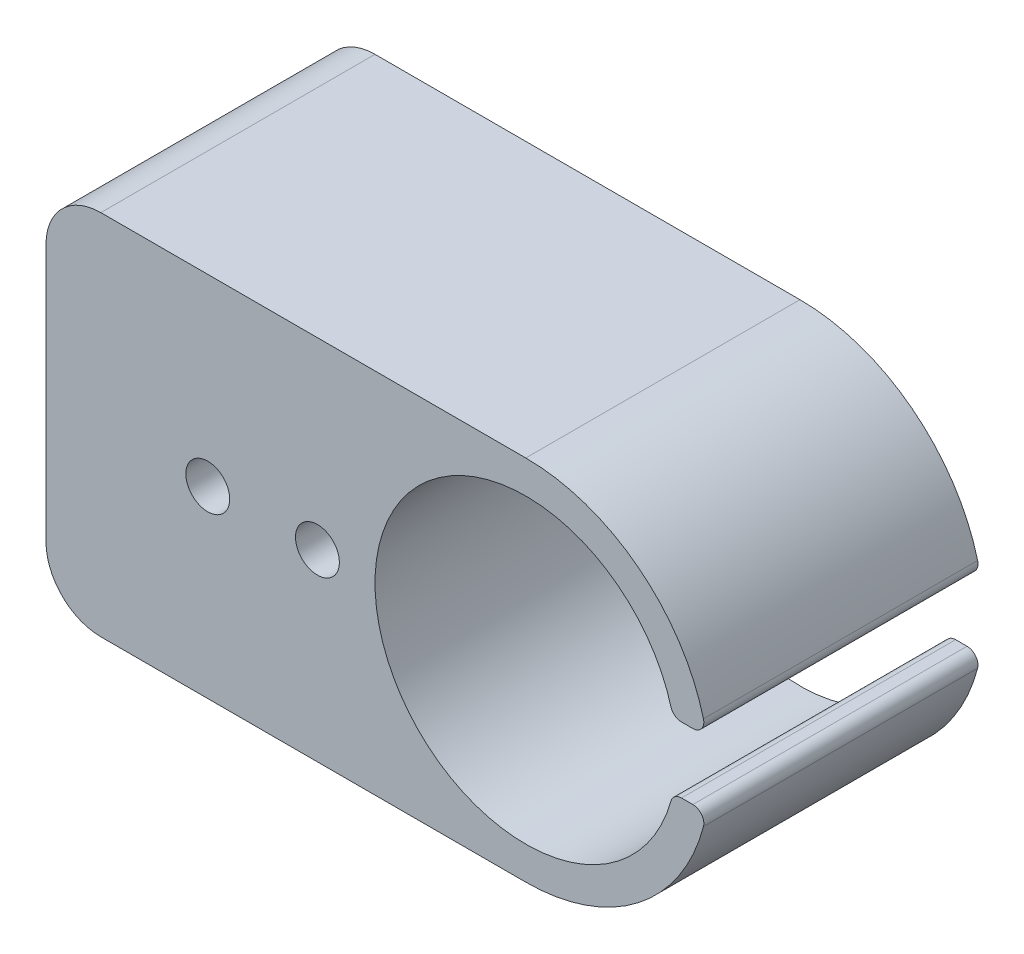
ISO-10303-21;
HEADER;
FILE_DESCRIPTION(('STEP AP214'),'2;1');
FILE_NAME('part.step','',(''),(''),'','','');
FILE_SCHEMA(('AUTOMOTIVE_DESIGN { 1 0 10303 214 1 1 1 1 }'));
ENDSEC;
DATA;
#1=APPLICATION_CONTEXT('core data for automotive mechanical design processes');
#2=APPLICATION_PROTOCOL_DEFINITION('international standard','automotive_design',2000,#1);
#3=PRODUCT_CONTEXT('',#1,'mechanical');
#4=PRODUCT('Part','Part','',(#3));
#5=PRODUCT_RELATED_PRODUCT_CATEGORY('part','',(#4));
#6=PRODUCT_DEFINITION_FORMATION('','',#4);
#7=PRODUCT_DEFINITION_CONTEXT('part definition',#1,'design');
#8=PRODUCT_DEFINITION('design','',#6,#7);
#9=PRODUCT_DEFINITION_SHAPE('','',#8);
#10=(LENGTH_UNIT() NAMED_UNIT(*) SI_UNIT(.MILLI.,.METRE.));
#11=(NAMED_UNIT(*) PLANE_ANGLE_UNIT() SI_UNIT($,.RADIAN.));
#12=(NAMED_UNIT(*) SI_UNIT($,.STERADIAN.) SOLID_ANGLE_UNIT());
#13=UNCERTAINTY_MEASURE_WITH_UNIT(LENGTH_MEASURE(1.E-05),#10,'distance_accuracy_value','');
#14=(GEOMETRIC_REPRESENTATION_CONTEXT(3) GLOBAL_UNCERTAINTY_ASSIGNED_CONTEXT((#13)) GLOBAL_UNIT_ASSIGNED_CONTEXT((#10,
#11,#12)) REPRESENTATION_CONTEXT('',''));
#15=CARTESIAN_POINT('',(0.,0.,0.));
#16=DIRECTION('',(0.,0.,1.));
#17=DIRECTION('',(1.,0.,0.));
#18=AXIS2_PLACEMENT_3D('',#15,#16,#17);
#19=CARTESIAN_POINT('',(0.,0.,25.));
#20=DIRECTION('',(0.,0.,1.));
#21=DIRECTION('',(1.,0.,0.));
#22=AXIS2_PLACEMENT_3D('',#19,#20,#21);
#23=PLANE('',#22);
#24=CARTESIAN_POINT('',(-29.,0.,25.));
#25=DIRECTION('',(0.,0.,1.));
#26=DIRECTION('',(1.,0.,0.));
#27=AXIS2_PLACEMENT_3D('',#24,#25,#26);
#28=CIRCLE('',#27,2.);
#29=CARTESIAN_POINT('',(-27.,0.,25.));
#30=VERTEX_POINT('',#29);
#31=EDGE_CURVE('E181',#30,#30,#28,.T.);
#32=ORIENTED_EDGE('',*,*,#31,.F.);
#33=EDGE_LOOP('',(#32));
#34=FACE_BOUND('',#33,.T.);
#35=CARTESIAN_POINT('',(0.,0.,25.));
#36=DIRECTION('',(0.,0.,1.));
#37=DIRECTION('',(-1.,0.,0.));
#38=AXIS2_PLACEMENT_3D('',#35,#36,#37);
#39=CIRCLE('',#38,16.75);
#40=CARTESIAN_POINT('',(0.,-16.75,25.));
#41=VERTEX_POINT('',#40);
#42=CARTESIAN_POINT('',(16.2008102912858,-4.25396825396825,25.));
#43=VERTEX_POINT('',#42);
#44=EDGE_CURVE('E172',#41,#43,#39,.T.);
#45=ORIENTED_EDGE('',*,*,#44,.T.);
#46=CARTESIAN_POINT('',(15.2335977365821,-4.,25.));
#47=DIRECTION('',(0.,0.,1.));
#48=DIRECTION('',(1.,0.,0.));
#49=AXIS2_PLACEMENT_3D('',#46,#47,#48);
#50=CIRCLE('',#49,1.);
#51=CARTESIAN_POINT('',(15.2335977365821,-3.,25.));
#52=VERTEX_POINT('',#51);
#53=EDGE_CURVE('E236',#43,#52,#50,.T.);
#54=ORIENTED_EDGE('',*,*,#53,.T.);
#55=DIRECTION('',(-1.,0.,0.));
#56=VECTOR('',#55,1.);
#57=CARTESIAN_POINT('',(16.479153497677,-3.,25.));
#58=LINE('',#57,#56);
#59=CARTESIAN_POINT('',(14.1972708645007,-3.,25.));
#60=VERTEX_POINT('',#59);
#61=EDGE_CURVE('E174',#52,#60,#58,.T.);
#62=ORIENTED_EDGE('',*,*,#61,.T.);
#63=CARTESIAN_POINT('',(14.1972708645007,-4.,25.));
#64=DIRECTION('',(0.,0.,1.));
#65=DIRECTION('',(1.,0.,0.));
#66=AXIS2_PLACEMENT_3D('',#63,#64,#65);
#67=CIRCLE('',#66,1.);
#68=CARTESIAN_POINT('',(13.2347440262295,-3.72881355932203,25.));
#69=VERTEX_POINT('',#68);
#70=EDGE_CURVE('E233',#60,#69,#67,.T.);
#71=ORIENTED_EDGE('',*,*,#70,.T.);
#72=CARTESIAN_POINT('',(0.,0.,25.));
#73=DIRECTION('',(0.,0.,-1.));
#74=DIRECTION('',(1.,0.,0.));
#75=AXIS2_PLACEMENT_3D('',#72,#73,#74);
#76=CIRCLE('',#75,13.75);
#77=CARTESIAN_POINT('',(13.2347440262295,3.72881355932203,25.));
#78=VERTEX_POINT('',#77);
#79=EDGE_CURVE('E197',#69,#78,#76,.T.);
#80=ORIENTED_EDGE('',*,*,#79,.T.);
#81=CARTESIAN_POINT('',(14.1972708645007,4.,25.));
#82=DIRECTION('',(0.,0.,1.));
#83=DIRECTION('',(1.,0.,0.));
#84=AXIS2_PLACEMENT_3D('',#81,#82,#83);
#85=CIRCLE('',#84,1.);
#86=CARTESIAN_POINT('',(14.1972708645007,3.,25.));
#87=VERTEX_POINT('',#86);
#88=EDGE_CURVE('E231',#78,#87,#85,.T.);
#89=ORIENTED_EDGE('',*,*,#88,.T.);
#90=DIRECTION('',(1.,0.,0.));
#91=VECTOR('',#90,1.);
#92=CARTESIAN_POINT('',(13.4187369003196,3.,25.));
#93=LINE('',#92,#91);
#94=CARTESIAN_POINT('',(15.2335977365821,3.,25.));
#95=VERTEX_POINT('',#94);
#96=EDGE_CURVE('E148',#87,#95,#93,.T.);
#97=ORIENTED_EDGE('',*,*,#96,.T.);
#98=CARTESIAN_POINT('',(15.2335977365821,4.,25.));
#99=DIRECTION('',(0.,0.,1.));
#100=DIRECTION('',(1.,0.,0.));
#101=AXIS2_PLACEMENT_3D('',#98,#99,#100);
#102=CIRCLE('',#101,1.);
#103=CARTESIAN_POINT('',(16.2008102912858,4.25396825396825,25.));
#104=VERTEX_POINT('',#103);
#105=EDGE_CURVE('E52',#95,#104,#102,.T.);
#106=ORIENTED_EDGE('',*,*,#105,.T.);
#107=CARTESIAN_POINT('',(0.,0.,25.));
#108=DIRECTION('',(0.,0.,1.));
#109=DIRECTION('',(1.,0.,0.));
#110=AXIS2_PLACEMENT_3D('',#107,#108,#109);
#111=CIRCLE('',#110,16.75);
#112=CARTESIAN_POINT('',(0.,16.75,25.));
#113=VERTEX_POINT('',#112);
#114=EDGE_CURVE('E138',#104,#113,#111,.T.);
#115=ORIENTED_EDGE('',*,*,#114,.T.);
#116=DIRECTION('',(-1.,0.,0.));
#117=VECTOR('',#116,1.);
#118=CARTESIAN_POINT('',(-43.75,16.75,25.));
#119=LINE('',#118,#117);
#120=CARTESIAN_POINT('',(-38.75,16.75,25.));
#121=VERTEX_POINT('',#120);
#122=EDGE_CURVE('E143',#113,#121,#119,.T.);
#123=ORIENTED_EDGE('',*,*,#122,.T.);
#124=CARTESIAN_POINT('',(-38.75,11.75,25.));
#125=DIRECTION('',(0.,0.,1.));
#126=DIRECTION('',(1.,0.,0.));
#127=AXIS2_PLACEMENT_3D('',#124,#125,#126);
#128=CIRCLE('',#127,5.);
#129=CARTESIAN_POINT('',(-43.75,11.75,25.));
#130=VERTEX_POINT('',#129);
#131=EDGE_CURVE('E211',#121,#130,#128,.T.);
#132=ORIENTED_EDGE('',*,*,#131,.T.);
#133=DIRECTION('',(0.,-1.,0.));
#134=VECTOR('',#133,1.);
#135=CARTESIAN_POINT('',(-43.75,-16.75,25.));
#136=LINE('',#135,#134);
#137=CARTESIAN_POINT('',(-43.75,-11.75,25.));
#138=VERTEX_POINT('',#137);
#139=EDGE_CURVE('E164',#130,#138,#136,.T.);
#140=ORIENTED_EDGE('',*,*,#139,.T.);
#141=CARTESIAN_POINT('',(-38.75,-11.75,25.));
#142=DIRECTION('',(0.,0.,1.));
#143=DIRECTION('',(1.,0.,0.));
#144=AXIS2_PLACEMENT_3D('',#141,#142,#143);
#145=CIRCLE('',#144,5.);
#146=CARTESIAN_POINT('',(-38.75,-16.75,25.));
#147=VERTEX_POINT('',#146);
#148=EDGE_CURVE('E213',#138,#147,#145,.T.);
#149=ORIENTED_EDGE('',*,*,#148,.T.);
#150=DIRECTION('',(1.,0.,0.));
#151=VECTOR('',#150,1.);
#152=CARTESIAN_POINT('',(0.,-16.75,25.));
#153=LINE('',#152,#151);
#154=EDGE_CURVE('E167',#147,#41,#153,.T.);
#155=ORIENTED_EDGE('',*,*,#154,.T.);
#156=EDGE_LOOP('',(#45,#54,#62,#71,#80,#89,#97,#106,#115,#123,#132,#140,#149,#155));
#157=FACE_BOUND('',#156,.T.);
#158=CARTESIAN_POINT('',(-19.,0.,25.));
#159=DIRECTION('',(0.,0.,1.));
#160=DIRECTION('',(1.,0.,0.));
#161=AXIS2_PLACEMENT_3D('',#158,#159,#160);
#162=CIRCLE('',#161,2.);
#163=CARTESIAN_POINT('',(-17.,0.,25.));
#164=VERTEX_POINT('',#163);
#165=EDGE_CURVE('E533',#164,#164,#162,.T.);
#166=ORIENTED_EDGE('',*,*,#165,.F.);
#167=EDGE_LOOP('',(#166));
#168=FACE_BOUND('',#167,.T.);
#169=ADVANCED_FACE('F37',(#34,#157,#168),#23,.T.);
#170=CARTESIAN_POINT('',(0.,0.,0.));
#171=DIRECTION('',(0.,0.,1.));
#172=DIRECTION('',(1.,0.,0.));
#173=AXIS2_PLACEMENT_3D('',#170,#171,#172);
#174=PLANE('',#173);
#175=DIRECTION('',(-1.,0.,0.));
#176=VECTOR('',#175,1.);
#177=CARTESIAN_POINT('',(16.479153497677,-3.,0.));
#178=LINE('',#177,#176);
#179=CARTESIAN_POINT('',(15.2335977365821,-3.,0.));
#180=VERTEX_POINT('',#179);
#181=CARTESIAN_POINT('',(14.1972708645007,-3.,0.));
#182=VERTEX_POINT('',#181);
#183=EDGE_CURVE('E194',#180,#182,#178,.T.);
#184=ORIENTED_EDGE('',*,*,#183,.F.);
#185=CARTESIAN_POINT('',(15.2335977365821,-4.,0.));
#186=DIRECTION('',(0.,0.,1.));
#187=DIRECTION('',(1.,0.,0.));
#188=AXIS2_PLACEMENT_3D('',#185,#186,#187);
#189=CIRCLE('',#188,1.);
#190=CARTESIAN_POINT('',(16.2008102912858,-4.25396825396825,0.));
#191=VERTEX_POINT('',#190);
#192=EDGE_CURVE('E227',#180,#191,#189,.F.);
#193=ORIENTED_EDGE('',*,*,#192,.T.);
#194=CARTESIAN_POINT('',(0.,0.,0.));
#195=DIRECTION('',(0.,0.,1.));
#196=DIRECTION('',(-1.,0.,0.));
#197=AXIS2_PLACEMENT_3D('',#194,#195,#196);
#198=CIRCLE('',#197,16.75);
#199=CARTESIAN_POINT('',(0.,-16.75,0.));
#200=VERTEX_POINT('',#199);
#201=EDGE_CURVE('E191',#200,#191,#198,.T.);
#202=ORIENTED_EDGE('',*,*,#201,.F.);
#203=DIRECTION('',(1.,0.,0.));
#204=VECTOR('',#203,1.);
#205=CARTESIAN_POINT('',(0.,-16.75,0.));
#206=LINE('',#205,#204);
#207=CARTESIAN_POINT('',(-38.75,-16.75,0.));
#208=VERTEX_POINT('',#207);
#209=EDGE_CURVE('E189',#208,#200,#206,.T.);
#210=ORIENTED_EDGE('',*,*,#209,.F.);
#211=CARTESIAN_POINT('',(-38.75,-11.75,0.));
#212=DIRECTION('',(0.,0.,1.));
#213=DIRECTION('',(1.,0.,0.));
#214=AXIS2_PLACEMENT_3D('',#211,#212,#213);
#215=CIRCLE('',#214,5.);
#216=CARTESIAN_POINT('',(-43.75,-11.75,0.));
#217=VERTEX_POINT('',#216);
#218=EDGE_CURVE('E204',#208,#217,#215,.F.);
#219=ORIENTED_EDGE('',*,*,#218,.T.);
#220=DIRECTION('',(0.,-1.,0.));
#221=VECTOR('',#220,1.);
#222=CARTESIAN_POINT('',(-43.75,-16.75,0.));
#223=LINE('',#222,#221);
#224=CARTESIAN_POINT('',(-43.75,11.75,0.));
#225=VERTEX_POINT('',#224);
#226=EDGE_CURVE('E186',#225,#217,#223,.T.);
#227=ORIENTED_EDGE('',*,*,#226,.F.);
#228=CARTESIAN_POINT('',(-38.75,11.75,0.));
#229=DIRECTION('',(0.,0.,1.));
#230=DIRECTION('',(1.,0.,0.));
#231=AXIS2_PLACEMENT_3D('',#228,#229,#230);
#232=CIRCLE('',#231,5.);
#233=CARTESIAN_POINT('',(-38.75,16.75,0.));
#234=VERTEX_POINT('',#233);
#235=EDGE_CURVE('E202',#225,#234,#232,.F.);
#236=ORIENTED_EDGE('',*,*,#235,.T.);
#237=DIRECTION('',(-1.,0.,0.));
#238=VECTOR('',#237,1.);
#239=CARTESIAN_POINT('',(-43.75,16.75,0.));
#240=LINE('',#239,#238);
#241=CARTESIAN_POINT('',(0.,16.75,0.));
#242=VERTEX_POINT('',#241);
#243=EDGE_CURVE('E184',#242,#234,#240,.T.);
#244=ORIENTED_EDGE('',*,*,#243,.F.);
#245=CARTESIAN_POINT('',(0.,0.,0.));
#246=DIRECTION('',(0.,0.,1.));
#247=DIRECTION('',(1.,0.,0.));
#248=AXIS2_PLACEMENT_3D('',#245,#246,#247);
#249=CIRCLE('',#248,16.75);
#250=CARTESIAN_POINT('',(16.2008102912858,4.25396825396825,0.));
#251=VERTEX_POINT('',#250);
#252=EDGE_CURVE('E154',#251,#242,#249,.T.);
#253=ORIENTED_EDGE('',*,*,#252,.F.);
#254=CARTESIAN_POINT('',(15.2335977365821,4.,0.));
#255=DIRECTION('',(0.,0.,1.));
#256=DIRECTION('',(1.,0.,0.));
#257=AXIS2_PLACEMENT_3D('',#254,#255,#256);
#258=CIRCLE('',#257,1.);
#259=CARTESIAN_POINT('',(15.2335977365821,3.,0.));
#260=VERTEX_POINT('',#259);
#261=EDGE_CURVE('E225',#251,#260,#258,.F.);
#262=ORIENTED_EDGE('',*,*,#261,.T.);
#263=DIRECTION('',(1.,0.,0.));
#264=VECTOR('',#263,1.);
#265=CARTESIAN_POINT('',(13.4187369003196,3.,0.));
#266=LINE('',#265,#264);
#267=CARTESIAN_POINT('',(14.1972708645007,3.,0.));
#268=VERTEX_POINT('',#267);
#269=EDGE_CURVE('E180',#268,#260,#266,.T.);
#270=ORIENTED_EDGE('',*,*,#269,.F.);
#271=CARTESIAN_POINT('',(14.1972708645007,4.,0.));
#272=DIRECTION('',(0.,0.,1.));
#273=DIRECTION('',(1.,0.,0.));
#274=AXIS2_PLACEMENT_3D('',#271,#272,#273);
#275=CIRCLE('',#274,1.);
#276=CARTESIAN_POINT('',(13.2347440262295,3.72881355932203,0.));
#277=VERTEX_POINT('',#276);
#278=EDGE_CURVE('E221',#268,#277,#275,.F.);
#279=ORIENTED_EDGE('',*,*,#278,.T.);
#280=CARTESIAN_POINT('',(0.,0.,0.));
#281=DIRECTION('',(0.,0.,-1.));
#282=DIRECTION('',(1.,0.,0.));
#283=AXIS2_PLACEMENT_3D('',#280,#281,#282);
#284=CIRCLE('',#283,13.75);
#285=CARTESIAN_POINT('',(13.2347440262295,-3.72881355932203,0.));
#286=VERTEX_POINT('',#285);
#287=EDGE_CURVE('E177',#286,#277,#284,.T.);
#288=ORIENTED_EDGE('',*,*,#287,.F.);
#289=CARTESIAN_POINT('',(14.1972708645007,-4.,0.));
#290=DIRECTION('',(0.,0.,1.));
#291=DIRECTION('',(1.,0.,0.));
#292=AXIS2_PLACEMENT_3D('',#289,#290,#291);
#293=CIRCLE('',#292,1.);
#294=EDGE_CURVE('E223',#286,#182,#293,.F.);
#295=ORIENTED_EDGE('',*,*,#294,.T.);
#296=EDGE_LOOP('',(#184,#193,#202,#210,#219,#227,#236,#244,#253,#262,#270,#279,#288,#295));
#297=FACE_BOUND('',#296,.T.);
#298=CARTESIAN_POINT('',(-29.,0.,0.));
#299=DIRECTION('',(0.,0.,1.));
#300=DIRECTION('',(1.,0.,0.));
#301=AXIS2_PLACEMENT_3D('',#298,#299,#300);
#302=CIRCLE('',#301,2.);
#303=CARTESIAN_POINT('',(-27.,0.,0.));
#304=VERTEX_POINT('',#303);
#305=EDGE_CURVE('E532',#304,#304,#302,.T.);
#306=ORIENTED_EDGE('',*,*,#305,.T.);
#307=EDGE_LOOP('',(#306));
#308=FACE_BOUND('',#307,.T.);
#309=CARTESIAN_POINT('',(-19.,0.,0.));
#310=DIRECTION('',(0.,0.,1.));
#311=DIRECTION('',(1.,0.,0.));
#312=AXIS2_PLACEMENT_3D('',#309,#310,#311);
#313=CIRCLE('',#312,2.);
#314=CARTESIAN_POINT('',(-17.,0.,0.));
#315=VERTEX_POINT('',#314);
#316=EDGE_CURVE('E537',#315,#315,#313,.T.);
#317=ORIENTED_EDGE('',*,*,#316,.T.);
#318=EDGE_LOOP('',(#317));
#319=FACE_BOUND('',#318,.T.);
#320=ADVANCED_FACE('F259',(#297,#308,#319),#174,.F.);
#321=CARTESIAN_POINT('',(0.,0.,25.));
#322=DIRECTION('',(0.,0.,-1.));
#323=DIRECTION('',(-1.,0.,0.));
#324=AXIS2_PLACEMENT_3D('',#321,#322,#323);
#325=CYLINDRICAL_SURFACE('',#324,13.75);
#326=ORIENTED_EDGE('',*,*,#79,.F.);
#327=DIRECTION('',(0.,0.,-1.));
#328=VECTOR('',#327,1.);
#329=CARTESIAN_POINT('',(13.2347440262294,-3.72881355932203,25.));
#330=LINE('',#329,#328);
#331=EDGE_CURVE('E11',#69,#286,#330,.T.);
#332=ORIENTED_EDGE('',*,*,#331,.T.);
#333=ORIENTED_EDGE('',*,*,#287,.T.);
#334=DIRECTION('',(0.,0.,-1.));
#335=VECTOR('',#334,1.);
#336=CARTESIAN_POINT('',(13.2347440262294,3.72881355932203,25.));
#337=LINE('',#336,#335);
#338=EDGE_CURVE('E45',#277,#78,#337,.F.);
#339=ORIENTED_EDGE('',*,*,#338,.T.);
#340=EDGE_LOOP('',(#326,#332,#333,#339));
#341=FACE_BOUND('',#340,.T.);
#342=ADVANCED_FACE('F247',(#341),#325,.F.);
#343=CARTESIAN_POINT('',(13.4187369003196,3.,25.));
#344=DIRECTION('',(0.,1.,0.));
#345=DIRECTION('',(0.,0.,1.));
#346=AXIS2_PLACEMENT_3D('',#343,#344,#345);
#347=PLANE('',#346);
#348=ORIENTED_EDGE('',*,*,#269,.T.);
#349=DIRECTION('',(0.,0.,-1.));
#350=VECTOR('',#349,1.);
#351=CARTESIAN_POINT('',(15.2335977365821,3.,25.));
#352=LINE('',#351,#350);
#353=EDGE_CURVE('E60',#260,#95,#352,.F.);
#354=ORIENTED_EDGE('',*,*,#353,.T.);
#355=ORIENTED_EDGE('',*,*,#96,.F.);
#356=DIRECTION('',(0.,0.,-1.));
#357=VECTOR('',#356,1.);
#358=CARTESIAN_POINT('',(14.1972708645007,3.,25.));
#359=LINE('',#358,#357);
#360=EDGE_CURVE('E240',#87,#268,#359,.T.);
#361=ORIENTED_EDGE('',*,*,#360,.T.);
#362=EDGE_LOOP('',(#348,#354,#355,#361));
#363=FACE_BOUND('',#362,.T.);
#364=ADVANCED_FACE('F256',(#363),#347,.F.);
#365=CARTESIAN_POINT('',(0.,0.,25.));
#366=DIRECTION('',(0.,0.,-1.));
#367=DIRECTION('',(-1.,0.,0.));
#368=AXIS2_PLACEMENT_3D('',#365,#366,#367);
#369=CYLINDRICAL_SURFACE('',#368,16.75);
#370=ORIENTED_EDGE('',*,*,#114,.F.);
#371=DIRECTION('',(0.,0.,-1.));
#372=VECTOR('',#371,1.);
#373=CARTESIAN_POINT('',(16.2008102912858,4.25396825396825,25.));
#374=LINE('',#373,#372);
#375=EDGE_CURVE('E238',#104,#251,#374,.T.);
#376=ORIENTED_EDGE('',*,*,#375,.T.);
#377=ORIENTED_EDGE('',*,*,#252,.T.);
#378=DIRECTION('',(0.,0.,-1.));
#379=VECTOR('',#378,1.);
#380=CARTESIAN_POINT('',(0.,16.75,25.));
#381=LINE('',#380,#379);
#382=EDGE_CURVE('E151',#113,#242,#381,.T.);
#383=ORIENTED_EDGE('',*,*,#382,.F.);
#384=EDGE_LOOP('',(#370,#376,#377,#383));
#385=FACE_BOUND('',#384,.T.);
#386=ADVANCED_FACE('F152',(#385),#369,.T.);
#387=CARTESIAN_POINT('',(-43.75,16.75,25.));
#388=DIRECTION('',(0.,-1.,0.));
#389=DIRECTION('',(0.,0.,-1.));
#390=AXIS2_PLACEMENT_3D('',#387,#388,#389);
#391=PLANE('',#390);
#392=ORIENTED_EDGE('',*,*,#243,.T.);
#393=DIRECTION('',(0.,0.,-1.));
#394=VECTOR('',#393,1.);
#395=CARTESIAN_POINT('',(-38.75,16.75,25.));
#396=LINE('',#395,#394);
#397=EDGE_CURVE('E163',#234,#121,#396,.F.);
#398=ORIENTED_EDGE('',*,*,#397,.T.);
#399=ORIENTED_EDGE('',*,*,#122,.F.);
#400=ORIENTED_EDGE('',*,*,#382,.T.);
#401=EDGE_LOOP('',(#392,#398,#399,#400));
#402=FACE_BOUND('',#401,.T.);
#403=ADVANCED_FACE('F161',(#402),#391,.F.);
#404=CARTESIAN_POINT('',(-43.75,-16.75,25.));
#405=DIRECTION('',(1.,0.,0.));
#406=DIRECTION('',(0.,0.,-1.));
#407=AXIS2_PLACEMENT_3D('',#404,#405,#406);
#408=PLANE('',#407);
#409=CARTESIAN_POINT('',(-43.75,0.,7.5));
#410=DIRECTION('',(-1.,0.,0.));
#411=DIRECTION('',(0.,0.,1.));
#412=AXIS2_PLACEMENT_3D('',#409,#410,#411);
#413=CIRCLE('',#412,2.);
#414=CARTESIAN_POINT('',(-43.75,0.,9.5));
#415=VERTEX_POINT('',#414);
#416=EDGE_CURVE('E549',#415,#415,#413,.T.);
#417=ORIENTED_EDGE('',*,*,#416,.F.);
#418=EDGE_LOOP('',(#417));
#419=FACE_BOUND('',#418,.T.);
#420=CARTESIAN_POINT('',(-43.75,0.,17.5));
#421=DIRECTION('',(-1.,0.,0.));
#422=DIRECTION('',(0.,0.,1.));
#423=AXIS2_PLACEMENT_3D('',#420,#421,#422);
#424=CIRCLE('',#423,2.);
#425=CARTESIAN_POINT('',(-43.75,0.,19.5));
#426=VERTEX_POINT('',#425);
#427=EDGE_CURVE('E546',#426,#426,#424,.T.);
#428=ORIENTED_EDGE('',*,*,#427,.F.);
#429=EDGE_LOOP('',(#428));
#430=FACE_BOUND('',#429,.T.);
#431=ORIENTED_EDGE('',*,*,#226,.T.);
#432=DIRECTION('',(0.,0.,-1.));
#433=VECTOR('',#432,1.);
#434=CARTESIAN_POINT('',(-43.75,-11.75,25.));
#435=LINE('',#434,#433);
#436=EDGE_CURVE('E209',#217,#138,#435,.F.);
#437=ORIENTED_EDGE('',*,*,#436,.T.);
#438=ORIENTED_EDGE('',*,*,#139,.F.);
#439=DIRECTION('',(0.,0.,-1.));
#440=VECTOR('',#439,1.);
#441=CARTESIAN_POINT('',(-43.75,11.75,25.));
#442=LINE('',#441,#440);
#443=EDGE_CURVE('E206',#130,#225,#442,.T.);
#444=ORIENTED_EDGE('',*,*,#443,.T.);
#445=EDGE_LOOP('',(#431,#437,#438,#444));
#446=FACE_BOUND('',#445,.T.);
#447=ADVANCED_FACE('F299',(#419,#430,#446),#408,.F.);
#448=CARTESIAN_POINT('',(0.,-16.75,25.));
#449=DIRECTION('',(0.,1.,0.));
#450=DIRECTION('',(0.,0.,1.));
#451=AXIS2_PLACEMENT_3D('',#448,#449,#450);
#452=PLANE('',#451);
#453=ORIENTED_EDGE('',*,*,#154,.F.);
#454=DIRECTION('',(0.,0.,-1.));
#455=VECTOR('',#454,1.);
#456=CARTESIAN_POINT('',(-38.75,-16.75,25.));
#457=LINE('',#456,#455);
#458=EDGE_CURVE('E158',#147,#208,#457,.T.);
#459=ORIENTED_EDGE('',*,*,#458,.T.);
#460=ORIENTED_EDGE('',*,*,#209,.T.);
#461=DIRECTION('',(0.,0.,-1.));
#462=VECTOR('',#461,1.);
#463=CARTESIAN_POINT('',(0.,-16.75,25.));
#464=LINE('',#463,#462);
#465=EDGE_CURVE('E159',#41,#200,#464,.T.);
#466=ORIENTED_EDGE('',*,*,#465,.F.);
#467=EDGE_LOOP('',(#453,#459,#460,#466));
#468=FACE_BOUND('',#467,.T.);
#469=ADVANCED_FACE('F295',(#468),#452,.F.);
#470=CARTESIAN_POINT('',(0.,0.,25.));
#471=DIRECTION('',(0.,0.,-1.));
#472=DIRECTION('',(-1.,0.,0.));
#473=AXIS2_PLACEMENT_3D('',#470,#471,#472);
#474=CYLINDRICAL_SURFACE('',#473,16.75);
#475=ORIENTED_EDGE('',*,*,#201,.T.);
#476=DIRECTION('',(0.,0.,-1.));
#477=VECTOR('',#476,1.);
#478=CARTESIAN_POINT('',(16.2008102912858,-4.25396825396825,25.));
#479=LINE('',#478,#477);
#480=EDGE_CURVE('E229',#191,#43,#479,.F.);
#481=ORIENTED_EDGE('',*,*,#480,.T.);
#482=ORIENTED_EDGE('',*,*,#44,.F.);
#483=ORIENTED_EDGE('',*,*,#465,.T.);
#484=EDGE_LOOP('',(#475,#481,#482,#483));
#485=FACE_BOUND('',#484,.T.);
#486=ADVANCED_FACE('F291',(#485),#474,.T.);
#487=CARTESIAN_POINT('',(16.479153497677,-3.,25.));
#488=DIRECTION('',(0.,-1.,0.));
#489=DIRECTION('',(0.,0.,-1.));
#490=AXIS2_PLACEMENT_3D('',#487,#488,#489);
#491=PLANE('',#490);
#492=ORIENTED_EDGE('',*,*,#61,.F.);
#493=DIRECTION('',(0.,0.,-1.));
#494=VECTOR('',#493,1.);
#495=CARTESIAN_POINT('',(15.2335977365821,-3.,25.));
#496=LINE('',#495,#494);
#497=EDGE_CURVE('E218',#52,#180,#496,.T.);
#498=ORIENTED_EDGE('',*,*,#497,.T.);
#499=ORIENTED_EDGE('',*,*,#183,.T.);
#500=DIRECTION('',(0.,0.,-1.));
#501=VECTOR('',#500,1.);
#502=CARTESIAN_POINT('',(14.1972708645007,-3.,25.));
#503=LINE('',#502,#501);
#504=EDGE_CURVE('E216',#182,#60,#503,.F.);
#505=ORIENTED_EDGE('',*,*,#504,.T.);
#506=EDGE_LOOP('',(#492,#498,#499,#505));
#507=FACE_BOUND('',#506,.T.);
#508=ADVANCED_FACE('F288',(#507),#491,.F.);
#509=CARTESIAN_POINT('',(-29.,0.,25.));
#510=DIRECTION('',(0.,0.,-1.));
#511=DIRECTION('',(-1.,0.,0.));
#512=AXIS2_PLACEMENT_3D('',#509,#510,#511);
#513=CYLINDRICAL_SURFACE('',#512,2.);
#514=ORIENTED_EDGE('',*,*,#31,.T.);
#515=EDGE_LOOP('',(#514));
#516=FACE_BOUND('',#515,.T.);
#517=ORIENTED_EDGE('',*,*,#305,.F.);
#518=EDGE_LOOP('',(#517));
#519=FACE_BOUND('',#518,.T.);
#520=ADVANCED_FACE('F285',(#516,#519),#513,.F.);
#521=CARTESIAN_POINT('',(-19.,0.,25.));
#522=DIRECTION('',(0.,0.,-1.));
#523=DIRECTION('',(-1.,0.,0.));
#524=AXIS2_PLACEMENT_3D('',#521,#522,#523);
#525=CYLINDRICAL_SURFACE('',#524,2.);
#526=ORIENTED_EDGE('',*,*,#165,.T.);
#527=EDGE_LOOP('',(#526));
#528=FACE_BOUND('',#527,.T.);
#529=ORIENTED_EDGE('',*,*,#316,.F.);
#530=EDGE_LOOP('',(#529));
#531=FACE_BOUND('',#530,.T.);
#532=ADVANCED_FACE('F418',(#528,#531),#525,.F.);
#533=CARTESIAN_POINT('',(-33.75,0.,17.5));
#534=DIRECTION('',(-1.,0.,0.));
#535=DIRECTION('',(0.,0.,1.));
#536=AXIS2_PLACEMENT_3D('',#533,#534,#535);
#537=CYLINDRICAL_SURFACE('',#536,2.);
#538=CARTESIAN_POINT('',(-33.75,0.,17.5));
#539=DIRECTION('',(-1.,0.,0.));
#540=DIRECTION('',(0.,0.,1.));
#541=AXIS2_PLACEMENT_3D('',#538,#539,#540);
#542=CIRCLE('',#541,2.);
#543=CARTESIAN_POINT('',(-33.75,0.,19.5));
#544=VERTEX_POINT('',#543);
#545=EDGE_CURVE('E543',#544,#544,#542,.T.);
#546=ORIENTED_EDGE('',*,*,#545,.F.);
#547=EDGE_LOOP('',(#546));
#548=FACE_BOUND('',#547,.T.);
#549=ORIENTED_EDGE('',*,*,#427,.T.);
#550=EDGE_LOOP('',(#549));
#551=FACE_BOUND('',#550,.T.);
#552=ADVANCED_FACE('F408',(#548,#551),#537,.F.);
#553=CARTESIAN_POINT('',(-33.75,0.,17.5));
#554=DIRECTION('',(-1.,0.,0.));
#555=DIRECTION('',(0.,0.,1.));
#556=AXIS2_PLACEMENT_3D('',#553,#554,#555);
#557=PLANE('',#556);
#558=ORIENTED_EDGE('',*,*,#545,.T.);
#559=EDGE_LOOP('',(#558));
#560=FACE_BOUND('',#559,.T.);
#561=ADVANCED_FACE('F398',(#560),#557,.T.);
#562=CARTESIAN_POINT('',(-33.75,0.,7.5));
#563=DIRECTION('',(-1.,0.,0.));
#564=DIRECTION('',(0.,0.,1.));
#565=AXIS2_PLACEMENT_3D('',#562,#563,#564);
#566=CYLINDRICAL_SURFACE('',#565,2.);
#567=CARTESIAN_POINT('',(-33.75,0.,7.5));
#568=DIRECTION('',(-1.,0.,0.));
#569=DIRECTION('',(0.,0.,1.));
#570=AXIS2_PLACEMENT_3D('',#567,#568,#569);
#571=CIRCLE('',#570,2.);
#572=CARTESIAN_POINT('',(-33.75,0.,9.5));
#573=VERTEX_POINT('',#572);
#574=EDGE_CURVE('E541',#573,#573,#571,.T.);
#575=ORIENTED_EDGE('',*,*,#574,.F.);
#576=EDGE_LOOP('',(#575));
#577=FACE_BOUND('',#576,.T.);
#578=ORIENTED_EDGE('',*,*,#416,.T.);
#579=EDGE_LOOP('',(#578));
#580=FACE_BOUND('',#579,.T.);
#581=ADVANCED_FACE('F388',(#577,#580),#566,.F.);
#582=CARTESIAN_POINT('',(-33.75,0.,7.5));
#583=DIRECTION('',(-1.,0.,0.));
#584=DIRECTION('',(0.,0.,1.));
#585=AXIS2_PLACEMENT_3D('',#582,#583,#584);
#586=PLANE('',#585);
#587=ORIENTED_EDGE('',*,*,#574,.T.);
#588=EDGE_LOOP('',(#587));
#589=FACE_BOUND('',#588,.T.);
#590=ADVANCED_FACE('F315',(#589),#586,.T.);
#591=CARTESIAN_POINT('',(-38.75,-11.75,25.));
#592=DIRECTION('',(0.,0.,-1.));
#593=DIRECTION('',(-1.,0.,0.));
#594=AXIS2_PLACEMENT_3D('',#591,#592,#593);
#595=CYLINDRICAL_SURFACE('',#594,5.);
#596=ORIENTED_EDGE('',*,*,#148,.F.);
#597=ORIENTED_EDGE('',*,*,#436,.F.);
#598=ORIENTED_EDGE('',*,*,#218,.F.);
#599=ORIENTED_EDGE('',*,*,#458,.F.);
#600=EDGE_LOOP('',(#596,#597,#598,#599));
#601=FACE_BOUND('',#600,.T.);
#602=ADVANCED_FACE('F312',(#601),#595,.T.);
#603=CARTESIAN_POINT('',(-38.75,11.75,25.));
#604=DIRECTION('',(0.,0.,-1.));
#605=DIRECTION('',(-1.,0.,0.));
#606=AXIS2_PLACEMENT_3D('',#603,#604,#605);
#607=CYLINDRICAL_SURFACE('',#606,5.);
#608=ORIENTED_EDGE('',*,*,#131,.F.);
#609=ORIENTED_EDGE('',*,*,#397,.F.);
#610=ORIENTED_EDGE('',*,*,#235,.F.);
#611=ORIENTED_EDGE('',*,*,#443,.F.);
#612=EDGE_LOOP('',(#608,#609,#610,#611));
#613=FACE_BOUND('',#612,.T.);
#614=ADVANCED_FACE('F272',(#613),#607,.T.);
#615=CARTESIAN_POINT('',(15.2335977365821,-4.,25.));
#616=DIRECTION('',(0.,0.,-1.));
#617=DIRECTION('',(-1.,0.,0.));
#618=AXIS2_PLACEMENT_3D('',#615,#616,#617);
#619=CYLINDRICAL_SURFACE('',#618,1.);
#620=ORIENTED_EDGE('',*,*,#53,.F.);
#621=ORIENTED_EDGE('',*,*,#480,.F.);
#622=ORIENTED_EDGE('',*,*,#192,.F.);
#623=ORIENTED_EDGE('',*,*,#497,.F.);
#624=EDGE_LOOP('',(#620,#621,#622,#623));
#625=FACE_BOUND('',#624,.T.);
#626=ADVANCED_FACE('F265',(#625),#619,.T.);
#627=CARTESIAN_POINT('',(15.2335977365821,4.,25.));
#628=DIRECTION('',(0.,0.,-1.));
#629=DIRECTION('',(-1.,0.,0.));
#630=AXIS2_PLACEMENT_3D('',#627,#628,#629);
#631=CYLINDRICAL_SURFACE('',#630,1.);
#632=ORIENTED_EDGE('',*,*,#105,.F.);
#633=ORIENTED_EDGE('',*,*,#353,.F.);
#634=ORIENTED_EDGE('',*,*,#261,.F.);
#635=ORIENTED_EDGE('',*,*,#375,.F.);
#636=EDGE_LOOP('',(#632,#633,#634,#635));
#637=FACE_BOUND('',#636,.T.);
#638=ADVANCED_FACE('F262',(#637),#631,.T.);
#639=CARTESIAN_POINT('',(14.1972708645007,-4.,25.));
#640=DIRECTION('',(0.,0.,-1.));
#641=DIRECTION('',(-1.,0.,0.));
#642=AXIS2_PLACEMENT_3D('',#639,#640,#641);
#643=CYLINDRICAL_SURFACE('',#642,1.);
#644=ORIENTED_EDGE('',*,*,#70,.F.);
#645=ORIENTED_EDGE('',*,*,#504,.F.);
#646=ORIENTED_EDGE('',*,*,#294,.F.);
#647=ORIENTED_EDGE('',*,*,#331,.F.);
#648=EDGE_LOOP('',(#644,#645,#646,#647));
#649=FACE_BOUND('',#648,.T.);
#650=ADVANCED_FACE('F264',(#649),#643,.T.);
#651=CARTESIAN_POINT('',(14.1972708645007,4.,25.));
#652=DIRECTION('',(0.,0.,-1.));
#653=DIRECTION('',(-1.,0.,0.));
#654=AXIS2_PLACEMENT_3D('',#651,#652,#653);
#655=CYLINDRICAL_SURFACE('',#654,1.);
#656=ORIENTED_EDGE('',*,*,#88,.F.);
#657=ORIENTED_EDGE('',*,*,#338,.F.);
#658=ORIENTED_EDGE('',*,*,#278,.F.);
#659=ORIENTED_EDGE('',*,*,#360,.F.);
#660=EDGE_LOOP('',(#656,#657,#658,#659));
#661=FACE_BOUND('',#660,.T.);
#662=ADVANCED_FACE('F39',(#661),#655,.T.);
#663=CLOSED_SHELL('',(#169,#320,#342,#364,#386,#403,#447,#469,#486,#508,#520,#532,#552,#561,
#581,#590,#602,#614,#626,#638,#650,#662));
#664=MANIFOLD_SOLID_BREP('B2',#663);
#665=ADVANCED_BREP_SHAPE_REPRESENTATION('',(#18,#664),#14);
#666=SHAPE_DEFINITION_REPRESENTATION(#9,#665);
ENDSEC;
END-ISO-10303-21;
